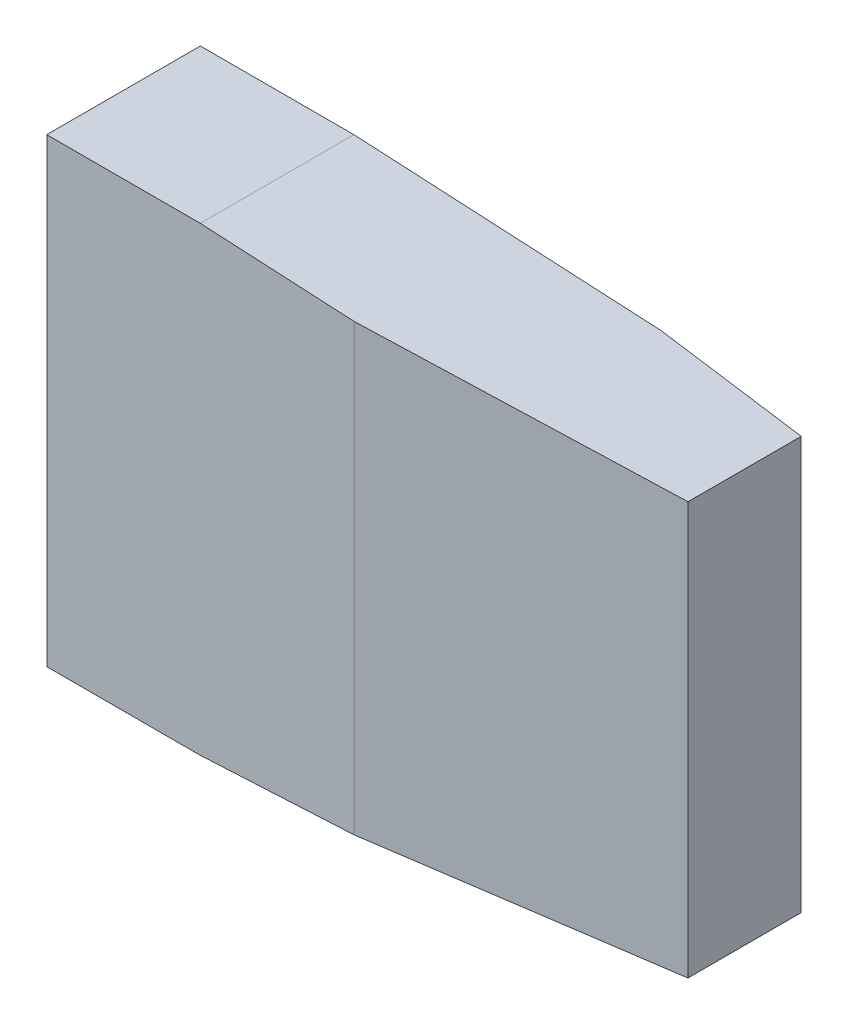
ISO-10303-21;
HEADER;
FILE_DESCRIPTION(('STEP AP214'),'2;1');
FILE_NAME('part.step','',(''),(''),'','','');
FILE_SCHEMA(('AUTOMOTIVE_DESIGN { 1 0 10303 214 1 1 1 1 }'));
ENDSEC;
DATA;
#1=APPLICATION_CONTEXT('core data for automotive mechanical design processes');
#2=APPLICATION_PROTOCOL_DEFINITION('international standard','automotive_design',2000,#1);
#3=PRODUCT_CONTEXT('',#1,'mechanical');
#4=PRODUCT('Part','Part','',(#3));
#5=PRODUCT_RELATED_PRODUCT_CATEGORY('part','',(#4));
#6=PRODUCT_DEFINITION_FORMATION('','',#4);
#7=PRODUCT_DEFINITION_CONTEXT('part definition',#1,'design');
#8=PRODUCT_DEFINITION('design','',#6,#7);
#9=PRODUCT_DEFINITION_SHAPE('','',#8);
#10=(LENGTH_UNIT() NAMED_UNIT(*) SI_UNIT(.MILLI.,.METRE.));
#11=(NAMED_UNIT(*) PLANE_ANGLE_UNIT() SI_UNIT($,.RADIAN.));
#12=(NAMED_UNIT(*) SI_UNIT($,.STERADIAN.) SOLID_ANGLE_UNIT());
#13=UNCERTAINTY_MEASURE_WITH_UNIT(LENGTH_MEASURE(1.E-05),#10,'distance_accuracy_value','');
#14=(GEOMETRIC_REPRESENTATION_CONTEXT(3) GLOBAL_UNCERTAINTY_ASSIGNED_CONTEXT((#13)) GLOBAL_UNIT_ASSIGNED_CONTEXT((#10,
#11,#12)) REPRESENTATION_CONTEXT('',''));
#15=CARTESIAN_POINT('',(0.,0.,0.));
#16=DIRECTION('',(0.,0.,1.));
#17=DIRECTION('',(1.,0.,0.));
#18=AXIS2_PLACEMENT_3D('',#15,#16,#17);
#19=CARTESIAN_POINT('',(100.,75.,25.));
#20=DIRECTION('',(-1.,0.,0.));
#21=DIRECTION('',(0.,0.,1.));
#22=AXIS2_PLACEMENT_3D('',#19,#20,#21);
#23=PLANE('',#22);
#24=DIRECTION('',(0.,1.,0.));
#25=VECTOR('',#24,1.);
#26=CARTESIAN_POINT('',(100.,75.,-20.6255668237038));
#27=LINE('',#26,#25);
#28=CARTESIAN_POINT('',(100.,-67.1388331075438,-20.6255668237038));
#29=VERTEX_POINT('',#28);
#30=CARTESIAN_POINT('',(100.,67.1388331075438,-20.6255668237038));
#31=VERTEX_POINT('',#30);
#32=EDGE_CURVE('E153',#29,#31,#27,.T.);
#33=ORIENTED_EDGE('',*,*,#32,.T.);
#34=DIRECTION('',(0.,0.,1.));
#35=VECTOR('',#34,1.);
#36=CARTESIAN_POINT('',(100.,67.1388331075438,25.));
#37=LINE('',#36,#35);
#38=CARTESIAN_POINT('',(100.,67.1388331075438,16.2511336474076));
#39=VERTEX_POINT('',#38);
#40=EDGE_CURVE('E68',#31,#39,#37,.T.);
#41=ORIENTED_EDGE('',*,*,#40,.T.);
#42=DIRECTION('',(0.,-1.,0.));
#43=VECTOR('',#42,1.);
#44=CARTESIAN_POINT('',(100.,75.,16.2511336474076));
#45=LINE('',#44,#43);
#46=CARTESIAN_POINT('',(100.,-67.1388331075438,16.2511336474076));
#47=VERTEX_POINT('',#46);
#48=EDGE_CURVE('E130',#39,#47,#45,.T.);
#49=ORIENTED_EDGE('',*,*,#48,.T.);
#50=DIRECTION('',(0.,0.,-1.));
#51=VECTOR('',#50,1.);
#52=CARTESIAN_POINT('',(100.,-67.1388331075438,-20.6255668237038));
#53=LINE('',#52,#51);
#54=EDGE_CURVE('E155',#47,#29,#53,.T.);
#55=ORIENTED_EDGE('',*,*,#54,.T.);
#56=EDGE_LOOP('',(#33,#41,#49,#55));
#57=FACE_BOUND('',#56,.T.);
#58=ADVANCED_FACE('F45',(#57),#23,.F.);
#59=CARTESIAN_POINT('',(-100.,75.,-25.));
#60=DIRECTION('',(0.,0.,1.));
#61=DIRECTION('',(1.,0.,0.));
#62=AXIS2_PLACEMENT_3D('',#59,#60,#61);
#63=PLANE('',#62);
#64=CARTESIAN_POINT('',(-12.,0.,-25.));
#65=DIRECTION('',(0.,0.,-1.));
#66=DIRECTION('',(-1.,0.,0.));
#67=AXIS2_PLACEMENT_3D('',#64,#65,#66);
#68=CIRCLE('',#67,8.);
#69=CARTESIAN_POINT('',(-20.,0.,-25.));
#70=VERTEX_POINT('',#69);
#71=EDGE_CURVE('E247',#70,#70,#68,.T.);
#72=ORIENTED_EDGE('',*,*,#71,.F.);
#73=EDGE_LOOP('',(#72));
#74=FACE_BOUND('',#73,.T.);
#75=DIRECTION('',(-1.,0.,0.));
#76=VECTOR('',#75,1.);
#77=CARTESIAN_POINT('',(-100.,75.,-25.));
#78=LINE('',#77,#76);
#79=CARTESIAN_POINT('',(-50.0000000000101,75.,-25.));
#80=VERTEX_POINT('',#79);
#81=CARTESIAN_POINT('',(-100.,75.,-25.));
#82=VERTEX_POINT('',#81);
#83=EDGE_CURVE('E111',#80,#82,#78,.T.);
#84=ORIENTED_EDGE('',*,*,#83,.F.);
#85=DIRECTION('',(-0.998629534754574,0.0523359562429404,0.));
#86=VECTOR('',#85,1.);
#87=CARTESIAN_POINT('',(-50.0000000000101,75.,-25.));
#88=LINE('',#87,#86);
#89=CARTESIAN_POINT('',(49.999999999998,69.7592220716958,-25.));
#90=VERTEX_POINT('',#89);
#91=EDGE_CURVE('E171',#80,#90,#88,.F.);
#92=ORIENTED_EDGE('',*,*,#91,.T.);
#93=DIRECTION('',(0.,-1.,0.));
#94=VECTOR('',#93,1.);
#95=CARTESIAN_POINT('',(49.999999999998,75.,-25.));
#96=LINE('',#95,#94);
#97=CARTESIAN_POINT('',(49.999999999998,-69.7592220716958,-25.));
#98=VERTEX_POINT('',#97);
#99=EDGE_CURVE('E151',#90,#98,#96,.T.);
#100=ORIENTED_EDGE('',*,*,#99,.T.);
#101=DIRECTION('',(-0.998629534754574,-0.0523359562429404,0.));
#102=VECTOR('',#101,1.);
#103=CARTESIAN_POINT('',(100.,-67.1388331075438,-25.));
#104=LINE('',#103,#102);
#105=CARTESIAN_POINT('',(-50.0000000000101,-75.,-25.));
#106=VERTEX_POINT('',#105);
#107=EDGE_CURVE('E161',#98,#106,#104,.T.);
#108=ORIENTED_EDGE('',*,*,#107,.T.);
#109=DIRECTION('',(-1.,0.,0.));
#110=VECTOR('',#109,1.);
#111=CARTESIAN_POINT('',(-100.,-75.,-25.));
#112=LINE('',#111,#110);
#113=CARTESIAN_POINT('',(-100.,-75.,-25.));
#114=VERTEX_POINT('',#113);
#115=EDGE_CURVE('E127',#106,#114,#112,.T.);
#116=ORIENTED_EDGE('',*,*,#115,.T.);
#117=DIRECTION('',(0.,-1.,0.));
#118=VECTOR('',#117,1.);
#119=CARTESIAN_POINT('',(-100.,75.,-25.));
#120=LINE('',#119,#118);
#121=EDGE_CURVE('E124',#82,#114,#120,.T.);
#122=ORIENTED_EDGE('',*,*,#121,.F.);
#123=EDGE_LOOP('',(#84,#92,#100,#108,#116,#122));
#124=FACE_BOUND('',#123,.T.);
#125=ADVANCED_FACE('F125',(#74,#124),#63,.F.);
#126=CARTESIAN_POINT('',(-100.,75.,25.));
#127=DIRECTION('',(1.,0.,0.));
#128=DIRECTION('',(0.,0.,-1.));
#129=AXIS2_PLACEMENT_3D('',#126,#127,#128);
#130=PLANE('',#129);
#131=DIRECTION('',(0.,0.,1.));
#132=VECTOR('',#131,1.);
#133=CARTESIAN_POINT('',(-100.,-75.,25.));
#134=LINE('',#133,#132);
#135=CARTESIAN_POINT('',(-100.,-75.,25.));
#136=VERTEX_POINT('',#135);
#137=EDGE_CURVE('E142',#114,#136,#134,.T.);
#138=ORIENTED_EDGE('',*,*,#137,.T.);
#139=DIRECTION('',(0.,-1.,0.));
#140=VECTOR('',#139,1.);
#141=CARTESIAN_POINT('',(-100.,75.,25.));
#142=LINE('',#141,#140);
#143=CARTESIAN_POINT('',(-100.,75.,25.));
#144=VERTEX_POINT('',#143);
#145=EDGE_CURVE('E131',#144,#136,#142,.T.);
#146=ORIENTED_EDGE('',*,*,#145,.F.);
#147=DIRECTION('',(0.,0.,1.));
#148=VECTOR('',#147,1.);
#149=CARTESIAN_POINT('',(-100.,75.,25.));
#150=LINE('',#149,#148);
#151=EDGE_CURVE('E116',#82,#144,#150,.T.);
#152=ORIENTED_EDGE('',*,*,#151,.F.);
#153=ORIENTED_EDGE('',*,*,#121,.T.);
#154=EDGE_LOOP('',(#138,#146,#152,#153));
#155=FACE_BOUND('',#154,.T.);
#156=ADVANCED_FACE('F133',(#155),#130,.F.);
#157=CARTESIAN_POINT('',(-100.,75.,25.));
#158=DIRECTION('',(0.,0.,-1.));
#159=DIRECTION('',(-1.,0.,0.));
#160=AXIS2_PLACEMENT_3D('',#157,#158,#159);
#161=PLANE('',#160);
#162=DIRECTION('',(0.,1.,0.));
#163=VECTOR('',#162,1.);
#164=CARTESIAN_POINT('',(-4.01068067645838E-12,75.,25.));
#165=LINE('',#164,#163);
#166=CARTESIAN_POINT('',(-4.01068067645838E-12,-72.3796110358478,25.));
#167=VERTEX_POINT('',#166);
#168=CARTESIAN_POINT('',(-4.01068067645838E-12,72.3796110358478,25.));
#169=VERTEX_POINT('',#168);
#170=EDGE_CURVE('E149',#167,#169,#165,.T.);
#171=ORIENTED_EDGE('',*,*,#170,.T.);
#172=DIRECTION('',(0.998629534754574,-0.0523359562429404,0.));
#173=VECTOR('',#172,1.);
#174=CARTESIAN_POINT('',(-50.0000000000101,75.,25.));
#175=LINE('',#174,#173);
#176=CARTESIAN_POINT('',(-50.0000000000101,75.,25.));
#177=VERTEX_POINT('',#176);
#178=EDGE_CURVE('E11',#169,#177,#175,.F.);
#179=ORIENTED_EDGE('',*,*,#178,.T.);
#180=DIRECTION('',(1.,0.,0.));
#181=VECTOR('',#180,1.);
#182=CARTESIAN_POINT('',(-100.,75.,25.));
#183=LINE('',#182,#181);
#184=EDGE_CURVE('E136',#144,#177,#183,.T.);
#185=ORIENTED_EDGE('',*,*,#184,.F.);
#186=ORIENTED_EDGE('',*,*,#145,.T.);
#187=DIRECTION('',(1.,0.,0.));
#188=VECTOR('',#187,1.);
#189=CARTESIAN_POINT('',(-100.,-75.,25.));
#190=LINE('',#189,#188);
#191=CARTESIAN_POINT('',(-50.0000000000101,-75.,25.));
#192=VERTEX_POINT('',#191);
#193=EDGE_CURVE('E121',#136,#192,#190,.T.);
#194=ORIENTED_EDGE('',*,*,#193,.T.);
#195=DIRECTION('',(0.998629534754574,0.0523359562429404,0.));
#196=VECTOR('',#195,1.);
#197=CARTESIAN_POINT('',(100.,-67.1388331075438,25.));
#198=LINE('',#197,#196);
#199=EDGE_CURVE('E165',#192,#167,#198,.T.);
#200=ORIENTED_EDGE('',*,*,#199,.T.);
#201=EDGE_LOOP('',(#171,#179,#185,#186,#194,#200));
#202=FACE_BOUND('',#201,.T.);
#203=ADVANCED_FACE('F184',(#202),#161,.F.);
#204=CARTESIAN_POINT('',(0.,75.,0.));
#205=DIRECTION('',(0.,-1.,0.));
#206=DIRECTION('',(0.,0.,-1.));
#207=AXIS2_PLACEMENT_3D('',#204,#205,#206);
#208=PLANE('',#207);
#209=ORIENTED_EDGE('',*,*,#184,.T.);
#210=DIRECTION('',(0.,0.,-1.));
#211=VECTOR('',#210,1.);
#212=CARTESIAN_POINT('',(-50.0000000000101,75.,0.));
#213=LINE('',#212,#211);
#214=EDGE_CURVE('E119',#177,#80,#213,.T.);
#215=ORIENTED_EDGE('',*,*,#214,.T.);
#216=ORIENTED_EDGE('',*,*,#83,.T.);
#217=ORIENTED_EDGE('',*,*,#151,.T.);
#218=EDGE_LOOP('',(#209,#215,#216,#217));
#219=FACE_BOUND('',#218,.T.);
#220=ADVANCED_FACE('F114',(#219),#208,.F.);
#221=CARTESIAN_POINT('',(0.,-75.,0.));
#222=DIRECTION('',(0.,-1.,0.));
#223=DIRECTION('',(0.,0.,-1.));
#224=AXIS2_PLACEMENT_3D('',#221,#222,#223);
#225=PLANE('',#224);
#226=ORIENTED_EDGE('',*,*,#115,.F.);
#227=DIRECTION('',(0.,0.,1.));
#228=VECTOR('',#227,1.);
#229=CARTESIAN_POINT('',(-50.0000000000101,-75.,16.2511336474076));
#230=LINE('',#229,#228);
#231=EDGE_CURVE('E163',#106,#192,#230,.T.);
#232=ORIENTED_EDGE('',*,*,#231,.T.);
#233=ORIENTED_EDGE('',*,*,#193,.F.);
#234=ORIENTED_EDGE('',*,*,#137,.F.);
#235=EDGE_LOOP('',(#226,#232,#233,#234));
#236=FACE_BOUND('',#235,.T.);
#237=ADVANCED_FACE('F193',(#236),#225,.T.);
#238=CARTESIAN_POINT('',(100.,75.,16.2511336474076));
#239=DIRECTION('',(-0.0871557427476548,0.,-0.996194698091746));
#240=DIRECTION('',(0.,-1.,0.));
#241=AXIS2_PLACEMENT_3D('',#238,#239,#240);
#242=PLANE('',#241);
#243=ORIENTED_EDGE('',*,*,#48,.F.);
#244=DIRECTION('',(-0.994839797341939,0.0521373445210784,0.087037204291844));
#245=VECTOR('',#244,1.);
#246=CARTESIAN_POINT('',(99.5922545959435,67.1602021386833,16.2868067478673));
#247=LINE('',#246,#245);
#248=EDGE_CURVE('E54',#39,#169,#247,.T.);
#249=ORIENTED_EDGE('',*,*,#248,.T.);
#250=ORIENTED_EDGE('',*,*,#170,.F.);
#251=DIRECTION('',(-0.994839797341939,-0.0521373445210784,0.087037204291844));
#252=VECTOR('',#251,1.);
#253=CARTESIAN_POINT('',(107.372500384538,-66.7524567346268,15.60612344192));
#254=LINE('',#253,#252);
#255=EDGE_CURVE('E167',#167,#47,#254,.F.);
#256=ORIENTED_EDGE('',*,*,#255,.T.);
#257=EDGE_LOOP('',(#243,#249,#250,#256));
#258=FACE_BOUND('',#257,.T.);
#259=ADVANCED_FACE('F187',(#258),#242,.F.);
#260=CARTESIAN_POINT('',(49.999999999998,75.,-25.));
#261=DIRECTION('',(-0.0871557427476548,0.,0.996194698091746));
#262=DIRECTION('',(0.,-1.,0.));
#263=AXIS2_PLACEMENT_3D('',#260,#261,#262);
#264=PLANE('',#263);
#265=ORIENTED_EDGE('',*,*,#99,.F.);
#266=DIRECTION('',(0.994839797341939,-0.0521373445210784,0.087037204291844));
#267=VECTOR('',#266,1.);
#268=CARTESIAN_POINT('',(49.728169730627,69.7734680924554,-25.0237820669732));
#269=LINE('',#268,#267);
#270=EDGE_CURVE('E173',#90,#31,#269,.T.);
#271=ORIENTED_EDGE('',*,*,#270,.T.);
#272=ORIENTED_EDGE('',*,*,#32,.F.);
#273=DIRECTION('',(0.994839797341939,0.0521373445210784,0.087037204291844));
#274=VECTOR('',#273,1.);
#275=CARTESIAN_POINT('',(57.5084155192215,-69.365722688399,-24.3430987610259));
#276=LINE('',#275,#274);
#277=EDGE_CURVE('E158',#29,#98,#276,.F.);
#278=ORIENTED_EDGE('',*,*,#277,.T.);
#279=EDGE_LOOP('',(#265,#271,#272,#278));
#280=FACE_BOUND('',#279,.T.);
#281=ADVANCED_FACE('F179',(#280),#264,.F.);
#282=CARTESIAN_POINT('',(100.,-67.1388331075438,25.));
#283=DIRECTION('',(0.0523359562429404,-0.998629534754574,0.));
#284=DIRECTION('',(0.,0.,1.));
#285=AXIS2_PLACEMENT_3D('',#282,#283,#284);
#286=PLANE('',#285);
#287=ORIENTED_EDGE('',*,*,#199,.F.);
#288=ORIENTED_EDGE('',*,*,#231,.F.);
#289=ORIENTED_EDGE('',*,*,#107,.F.);
#290=ORIENTED_EDGE('',*,*,#277,.F.);
#291=ORIENTED_EDGE('',*,*,#54,.F.);
#292=ORIENTED_EDGE('',*,*,#255,.F.);
#293=EDGE_LOOP('',(#287,#288,#289,#290,#291,#292));
#294=FACE_BOUND('',#293,.T.);
#295=ADVANCED_FACE('F189',(#294),#286,.T.);
#296=CARTESIAN_POINT('',(-50.0000000000101,75.,0.));
#297=DIRECTION('',(-0.0523359562429404,-0.998629534754574,0.));
#298=DIRECTION('',(0.,0.,-1.));
#299=AXIS2_PLACEMENT_3D('',#296,#297,#298);
#300=PLANE('',#299);
#301=ORIENTED_EDGE('',*,*,#248,.F.);
#302=ORIENTED_EDGE('',*,*,#40,.F.);
#303=ORIENTED_EDGE('',*,*,#270,.F.);
#304=ORIENTED_EDGE('',*,*,#91,.F.);
#305=ORIENTED_EDGE('',*,*,#214,.F.);
#306=ORIENTED_EDGE('',*,*,#178,.F.);
#307=EDGE_LOOP('',(#301,#302,#303,#304,#305,#306));
#308=FACE_BOUND('',#307,.T.);
#309=ADVANCED_FACE('F48',(#308),#300,.F.);
#310=CARTESIAN_POINT('',(-12.,0.,-20.));
#311=DIRECTION('',(0.,0.,-1.));
#312=DIRECTION('',(-1.,0.,0.));
#313=AXIS2_PLACEMENT_3D('',#310,#311,#312);
#314=CYLINDRICAL_SURFACE('',#313,8.);
#315=CARTESIAN_POINT('',(-12.,0.,-20.));
#316=DIRECTION('',(0.,0.,-1.));
#317=DIRECTION('',(-1.,0.,0.));
#318=AXIS2_PLACEMENT_3D('',#315,#316,#317);
#319=CIRCLE('',#318,8.);
#320=CARTESIAN_POINT('',(-20.,0.,-20.));
#321=VERTEX_POINT('',#320);
#322=EDGE_CURVE('E143',#321,#321,#319,.T.);
#323=ORIENTED_EDGE('',*,*,#322,.F.);
#324=EDGE_LOOP('',(#323));
#325=FACE_BOUND('',#324,.T.);
#326=ORIENTED_EDGE('',*,*,#71,.T.);
#327=EDGE_LOOP('',(#326));
#328=FACE_BOUND('',#327,.T.);
#329=ADVANCED_FACE('F230',(#325,#328),#314,.F.);
#330=CARTESIAN_POINT('',(-12.,0.,-20.));
#331=DIRECTION('',(0.,0.,-1.));
#332=DIRECTION('',(-1.,0.,0.));
#333=AXIS2_PLACEMENT_3D('',#330,#331,#332);
#334=PLANE('',#333);
#335=ORIENTED_EDGE('',*,*,#322,.T.);
#336=EDGE_LOOP('',(#335));
#337=FACE_BOUND('',#336,.T.);
#338=ADVANCED_FACE('F234',(#337),#334,.T.);
#339=CLOSED_SHELL('',(#58,#125,#156,#203,#220,#237,#259,#281,#295,#309,#329,#338));
#340=MANIFOLD_SOLID_BREP('B2',#339);
#341=ADVANCED_BREP_SHAPE_REPRESENTATION('',(#18,#340),#14);
#342=SHAPE_DEFINITION_REPRESENTATION(#9,#341);
ENDSEC;
END-ISO-10303-21;
